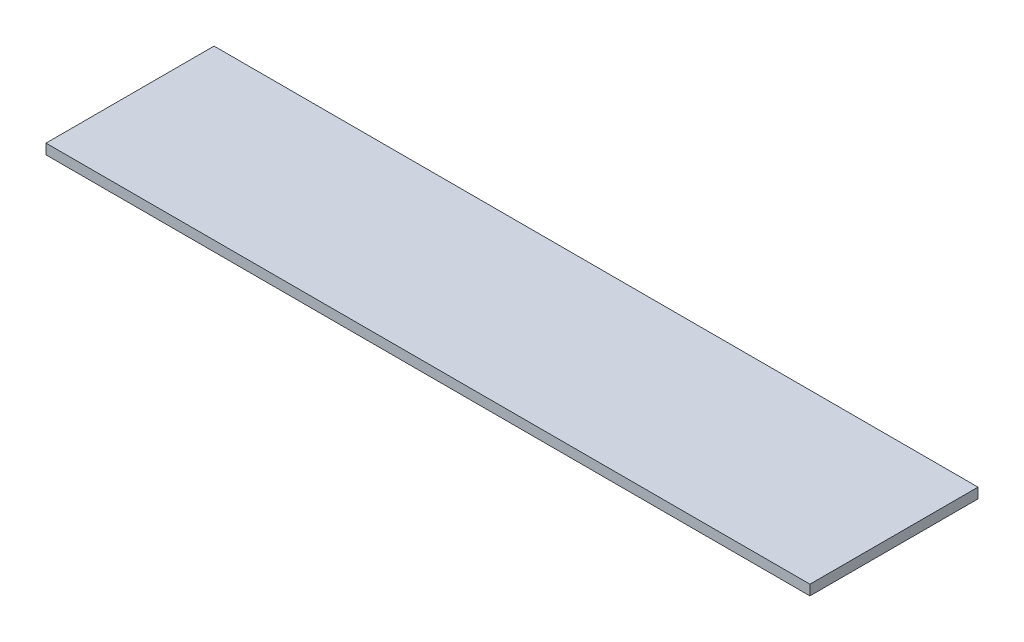
ISO-10303-21;
HEADER;
FILE_DESCRIPTION(('STEP AP214'),'2;1');
FILE_NAME('part.step','',(''),(''),'','','');
FILE_SCHEMA(('AUTOMOTIVE_DESIGN { 1 0 10303 214 1 1 1 1 }'));
ENDSEC;
DATA;
#1=APPLICATION_CONTEXT('core data for automotive mechanical design processes');
#2=APPLICATION_PROTOCOL_DEFINITION('international standard','automotive_design',2000,#1);
#3=PRODUCT_CONTEXT('',#1,'mechanical');
#4=PRODUCT('Part','Part','',(#3));
#5=PRODUCT_RELATED_PRODUCT_CATEGORY('part','',(#4));
#6=PRODUCT_DEFINITION_FORMATION('','',#4);
#7=PRODUCT_DEFINITION_CONTEXT('part definition',#1,'design');
#8=PRODUCT_DEFINITION('design','',#6,#7);
#9=PRODUCT_DEFINITION_SHAPE('','',#8);
#10=(LENGTH_UNIT() NAMED_UNIT(*) SI_UNIT(.MILLI.,.METRE.));
#11=(NAMED_UNIT(*) PLANE_ANGLE_UNIT() SI_UNIT($,.RADIAN.));
#12=(NAMED_UNIT(*) SI_UNIT($,.STERADIAN.) SOLID_ANGLE_UNIT());
#13=UNCERTAINTY_MEASURE_WITH_UNIT(LENGTH_MEASURE(1.E-05),#10,'distance_accuracy_value','');
#14=(GEOMETRIC_REPRESENTATION_CONTEXT(3) GLOBAL_UNCERTAINTY_ASSIGNED_CONTEXT((#13)) GLOBAL_UNIT_ASSIGNED_CONTEXT((#10,
#11,#12)) REPRESENTATION_CONTEXT('',''));
#15=CARTESIAN_POINT('',(0.,0.,0.));
#16=DIRECTION('',(0.,0.,1.));
#17=DIRECTION('',(1.,0.,0.));
#18=AXIS2_PLACEMENT_3D('',#15,#16,#17);
#19=CARTESIAN_POINT('',(75.,1.,16.5));
#20=DIRECTION('',(-1.,0.,0.));
#21=DIRECTION('',(0.,0.,1.));
#22=AXIS2_PLACEMENT_3D('',#19,#20,#21);
#23=PLANE('',#22);
#24=DIRECTION('',(0.,0.,-1.));
#25=VECTOR('',#24,1.);
#26=CARTESIAN_POINT('',(75.,-1.,16.5));
#27=LINE('',#26,#25);
#28=CARTESIAN_POINT('',(75.,-1.,16.5));
#29=VERTEX_POINT('',#28);
#30=CARTESIAN_POINT('',(75.,-1.,-16.5));
#31=VERTEX_POINT('',#30);
#32=EDGE_CURVE('E95',#29,#31,#27,.T.);
#33=ORIENTED_EDGE('',*,*,#32,.T.);
#34=DIRECTION('',(0.,-1.,0.));
#35=VECTOR('',#34,1.);
#36=CARTESIAN_POINT('',(75.,1.,-16.5));
#37=LINE('',#36,#35);
#38=CARTESIAN_POINT('',(75.,1.,-16.5));
#39=VERTEX_POINT('',#38);
#40=EDGE_CURVE('E11',#39,#31,#37,.T.);
#41=ORIENTED_EDGE('',*,*,#40,.F.);
#42=DIRECTION('',(0.,0.,-1.));
#43=VECTOR('',#42,1.);
#44=CARTESIAN_POINT('',(75.,1.,16.5));
#45=LINE('',#44,#43);
#46=CARTESIAN_POINT('',(75.,1.,16.5));
#47=VERTEX_POINT('',#46);
#48=EDGE_CURVE('E83',#47,#39,#45,.T.);
#49=ORIENTED_EDGE('',*,*,#48,.F.);
#50=DIRECTION('',(0.,-1.,0.));
#51=VECTOR('',#50,1.);
#52=CARTESIAN_POINT('',(75.,1.,16.5));
#53=LINE('',#52,#51);
#54=EDGE_CURVE('E91',#47,#29,#53,.T.);
#55=ORIENTED_EDGE('',*,*,#54,.T.);
#56=EDGE_LOOP('',(#33,#41,#49,#55));
#57=FACE_BOUND('',#56,.T.);
#58=ADVANCED_FACE('F32',(#57),#23,.F.);
#59=CARTESIAN_POINT('',(-75.,1.,-16.5));
#60=DIRECTION('',(0.,0.,1.));
#61=DIRECTION('',(1.,0.,0.));
#62=AXIS2_PLACEMENT_3D('',#59,#60,#61);
#63=PLANE('',#62);
#64=DIRECTION('',(-1.,0.,0.));
#65=VECTOR('',#64,1.);
#66=CARTESIAN_POINT('',(-75.,-1.,-16.5));
#67=LINE('',#66,#65);
#68=CARTESIAN_POINT('',(-75.,-1.,-16.5));
#69=VERTEX_POINT('',#68);
#70=EDGE_CURVE('E87',#31,#69,#67,.T.);
#71=ORIENTED_EDGE('',*,*,#70,.T.);
#72=DIRECTION('',(0.,-1.,0.));
#73=VECTOR('',#72,1.);
#74=CARTESIAN_POINT('',(-75.,1.,-16.5));
#75=LINE('',#74,#73);
#76=CARTESIAN_POINT('',(-75.,1.,-16.5));
#77=VERTEX_POINT('',#76);
#78=EDGE_CURVE('E40',#77,#69,#75,.T.);
#79=ORIENTED_EDGE('',*,*,#78,.F.);
#80=DIRECTION('',(-1.,0.,0.));
#81=VECTOR('',#80,1.);
#82=CARTESIAN_POINT('',(-75.,1.,-16.5));
#83=LINE('',#82,#81);
#84=EDGE_CURVE('E78',#39,#77,#83,.T.);
#85=ORIENTED_EDGE('',*,*,#84,.F.);
#86=ORIENTED_EDGE('',*,*,#40,.T.);
#87=EDGE_LOOP('',(#71,#79,#85,#86));
#88=FACE_BOUND('',#87,.T.);
#89=ADVANCED_FACE('F86',(#88),#63,.F.);
#90=CARTESIAN_POINT('',(-75.,1.,16.5));
#91=DIRECTION('',(1.,0.,0.));
#92=DIRECTION('',(0.,0.,-1.));
#93=AXIS2_PLACEMENT_3D('',#90,#91,#92);
#94=PLANE('',#93);
#95=DIRECTION('',(0.,0.,1.));
#96=VECTOR('',#95,1.);
#97=CARTESIAN_POINT('',(-75.,-1.,16.5));
#98=LINE('',#97,#96);
#99=CARTESIAN_POINT('',(-75.,-1.,16.5));
#100=VERTEX_POINT('',#99);
#101=EDGE_CURVE('E65',#69,#100,#98,.T.);
#102=ORIENTED_EDGE('',*,*,#101,.T.);
#103=DIRECTION('',(0.,-1.,0.));
#104=VECTOR('',#103,1.);
#105=CARTESIAN_POINT('',(-75.,1.,16.5));
#106=LINE('',#105,#104);
#107=CARTESIAN_POINT('',(-75.,1.,16.5));
#108=VERTEX_POINT('',#107);
#109=EDGE_CURVE('E88',#108,#100,#106,.T.);
#110=ORIENTED_EDGE('',*,*,#109,.F.);
#111=DIRECTION('',(0.,0.,1.));
#112=VECTOR('',#111,1.);
#113=CARTESIAN_POINT('',(-75.,1.,16.5));
#114=LINE('',#113,#112);
#115=EDGE_CURVE('E81',#77,#108,#114,.T.);
#116=ORIENTED_EDGE('',*,*,#115,.F.);
#117=ORIENTED_EDGE('',*,*,#78,.T.);
#118=EDGE_LOOP('',(#102,#110,#116,#117));
#119=FACE_BOUND('',#118,.T.);
#120=ADVANCED_FACE('F89',(#119),#94,.F.);
#121=CARTESIAN_POINT('',(-75.,1.,16.5));
#122=DIRECTION('',(0.,0.,-1.));
#123=DIRECTION('',(-1.,0.,0.));
#124=AXIS2_PLACEMENT_3D('',#121,#122,#123);
#125=PLANE('',#124);
#126=DIRECTION('',(1.,0.,0.));
#127=VECTOR('',#126,1.);
#128=CARTESIAN_POINT('',(-75.,-1.,16.5));
#129=LINE('',#128,#127);
#130=EDGE_CURVE('E71',#100,#29,#129,.T.);
#131=ORIENTED_EDGE('',*,*,#130,.T.);
#132=ORIENTED_EDGE('',*,*,#54,.F.);
#133=DIRECTION('',(1.,0.,0.));
#134=VECTOR('',#133,1.);
#135=CARTESIAN_POINT('',(-75.,1.,16.5));
#136=LINE('',#135,#134);
#137=EDGE_CURVE('E48',#108,#47,#136,.T.);
#138=ORIENTED_EDGE('',*,*,#137,.F.);
#139=ORIENTED_EDGE('',*,*,#109,.T.);
#140=EDGE_LOOP('',(#131,#132,#138,#139));
#141=FACE_BOUND('',#140,.T.);
#142=ADVANCED_FACE('F102',(#141),#125,.F.);
#143=CARTESIAN_POINT('',(0.,1.,0.));
#144=DIRECTION('',(0.,-1.,0.));
#145=DIRECTION('',(0.,0.,-1.));
#146=AXIS2_PLACEMENT_3D('',#143,#144,#145);
#147=PLANE('',#146);
#148=ORIENTED_EDGE('',*,*,#48,.T.);
#149=ORIENTED_EDGE('',*,*,#84,.T.);
#150=ORIENTED_EDGE('',*,*,#115,.T.);
#151=ORIENTED_EDGE('',*,*,#137,.T.);
#152=EDGE_LOOP('',(#148,#149,#150,#151));
#153=FACE_BOUND('',#152,.T.);
#154=ADVANCED_FACE('F79',(#153),#147,.F.);
#155=CARTESIAN_POINT('',(0.,-1.,0.));
#156=DIRECTION('',(0.,-1.,0.));
#157=DIRECTION('',(0.,0.,-1.));
#158=AXIS2_PLACEMENT_3D('',#155,#156,#157);
#159=PLANE('',#158);
#160=ORIENTED_EDGE('',*,*,#32,.F.);
#161=ORIENTED_EDGE('',*,*,#130,.F.);
#162=ORIENTED_EDGE('',*,*,#101,.F.);
#163=ORIENTED_EDGE('',*,*,#70,.F.);
#164=EDGE_LOOP('',(#160,#161,#162,#163));
#165=FACE_BOUND('',#164,.T.);
#166=ADVANCED_FACE('F105',(#165),#159,.T.);
#167=CLOSED_SHELL('',(#58,#89,#120,#142,#154,#166));
#168=MANIFOLD_SOLID_BREP('B2',#167);
#169=ADVANCED_BREP_SHAPE_REPRESENTATION('',(#18,#168),#14);
#170=SHAPE_DEFINITION_REPRESENTATION(#9,#169);
ENDSEC;
END-ISO-10303-21;
